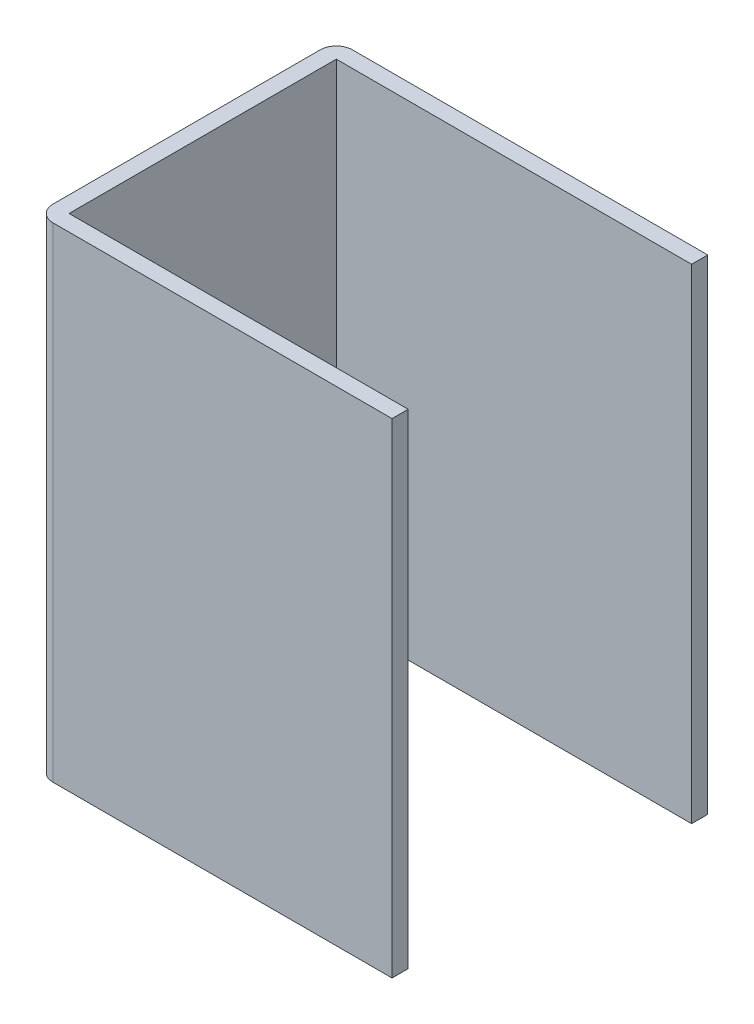
ISO-10303-21;
HEADER;
FILE_DESCRIPTION(('STEP AP214'),'2;1');
FILE_NAME('part.step','',(''),(''),'','','');
FILE_SCHEMA(('AUTOMOTIVE_DESIGN { 1 0 10303 214 1 1 1 1 }'));
ENDSEC;
DATA;
#1=APPLICATION_CONTEXT('core data for automotive mechanical design processes');
#2=APPLICATION_PROTOCOL_DEFINITION('international standard','automotive_design',2000,#1);
#3=PRODUCT_CONTEXT('',#1,'mechanical');
#4=PRODUCT('Part','Part','',(#3));
#5=PRODUCT_RELATED_PRODUCT_CATEGORY('part','',(#4));
#6=PRODUCT_DEFINITION_FORMATION('','',#4);
#7=PRODUCT_DEFINITION_CONTEXT('part definition',#1,'design');
#8=PRODUCT_DEFINITION('design','',#6,#7);
#9=PRODUCT_DEFINITION_SHAPE('','',#8);
#10=(LENGTH_UNIT() NAMED_UNIT(*) SI_UNIT(.MILLI.,.METRE.));
#11=(NAMED_UNIT(*) PLANE_ANGLE_UNIT() SI_UNIT($,.RADIAN.));
#12=(NAMED_UNIT(*) SI_UNIT($,.STERADIAN.) SOLID_ANGLE_UNIT());
#13=UNCERTAINTY_MEASURE_WITH_UNIT(LENGTH_MEASURE(1.E-05),#10,'distance_accuracy_value','');
#14=(GEOMETRIC_REPRESENTATION_CONTEXT(3) GLOBAL_UNCERTAINTY_ASSIGNED_CONTEXT((#13)) GLOBAL_UNIT_ASSIGNED_CONTEXT((#10,
#11,#12)) REPRESENTATION_CONTEXT('',''));
#15=CARTESIAN_POINT('',(0.,0.,0.));
#16=DIRECTION('',(0.,0.,1.));
#17=DIRECTION('',(1.,0.,0.));
#18=AXIS2_PLACEMENT_3D('',#15,#16,#17);
#19=CARTESIAN_POINT('',(-5.4,-1.5,1.755));
#20=DIRECTION('',(0.,1.,0.));
#21=DIRECTION('',(0.,0.,1.));
#22=AXIS2_PLACEMENT_3D('',#19,#20,#21);
#23=CYLINDRICAL_SURFACE('',#22,0.1);
#24=DIRECTION('',(0.,1.,0.));
#25=VECTOR('',#24,1.);
#26=CARTESIAN_POINT('',(-5.5,-1.5,1.755));
#27=LINE('',#26,#25);
#28=CARTESIAN_POINT('',(-5.5,1.5,1.755));
#29=VERTEX_POINT('',#28);
#30=CARTESIAN_POINT('',(-5.5,-1.5,1.755));
#31=VERTEX_POINT('',#30);
#32=EDGE_CURVE('E95',#29,#31,#27,.F.);
#33=ORIENTED_EDGE('',*,*,#32,.T.);
#34=CARTESIAN_POINT('',(-5.4,-1.5,1.755));
#35=DIRECTION('',(0.,1.,0.));
#36=DIRECTION('',(0.,0.,1.));
#37=AXIS2_PLACEMENT_3D('',#34,#35,#36);
#38=CIRCLE('',#37,0.1);
#39=CARTESIAN_POINT('',(-5.4,-1.5,1.855));
#40=VERTEX_POINT('',#39);
#41=EDGE_CURVE('E99',#31,#40,#38,.T.);
#42=ORIENTED_EDGE('',*,*,#41,.T.);
#43=DIRECTION('',(0.,1.,0.));
#44=VECTOR('',#43,1.);
#45=CARTESIAN_POINT('',(-5.4,-1.5,1.855));
#46=LINE('',#45,#44);
#47=CARTESIAN_POINT('',(-5.4,1.5,1.855));
#48=VERTEX_POINT('',#47);
#49=EDGE_CURVE('E97',#48,#40,#46,.F.);
#50=ORIENTED_EDGE('',*,*,#49,.F.);
#51=CARTESIAN_POINT('',(-5.4,1.5,1.755));
#52=DIRECTION('',(0.,1.,0.));
#53=DIRECTION('',(0.,0.,1.));
#54=AXIS2_PLACEMENT_3D('',#51,#52,#53);
#55=CIRCLE('',#54,0.1);
#56=EDGE_CURVE('E20',#48,#29,#55,.F.);
#57=ORIENTED_EDGE('',*,*,#56,.T.);
#58=EDGE_LOOP('',(#33,#42,#50,#57));
#59=FACE_BOUND('',#58,.T.);
#60=ADVANCED_FACE('F17',(#59),#23,.T.);
#61=CARTESIAN_POINT('',(-3.3,-1.5,1.755));
#62=DIRECTION('',(1.,0.,0.));
#63=DIRECTION('',(0.,0.,-1.));
#64=AXIS2_PLACEMENT_3D('',#61,#62,#63);
#65=PLANE('',#64);
#66=DIRECTION('',(0.,0.,-1.));
#67=VECTOR('',#66,1.);
#68=CARTESIAN_POINT('',(-3.3,1.5,1.755));
#69=LINE('',#68,#67);
#70=CARTESIAN_POINT('',(-3.3,1.5,1.755));
#71=VERTEX_POINT('',#70);
#72=CARTESIAN_POINT('',(-3.3,1.5,1.855));
#73=VERTEX_POINT('',#72);
#74=EDGE_CURVE('E162',#71,#73,#69,.F.);
#75=ORIENTED_EDGE('',*,*,#74,.T.);
#76=DIRECTION('',(0.,1.,0.));
#77=VECTOR('',#76,1.);
#78=CARTESIAN_POINT('',(-3.3,-1.5,1.855));
#79=LINE('',#78,#77);
#80=CARTESIAN_POINT('',(-3.3,-1.5,1.855));
#81=VERTEX_POINT('',#80);
#82=EDGE_CURVE('E149',#81,#73,#79,.T.);
#83=ORIENTED_EDGE('',*,*,#82,.F.);
#84=DIRECTION('',(0.,0.,-1.));
#85=VECTOR('',#84,1.);
#86=CARTESIAN_POINT('',(-3.3,-1.5,1.755));
#87=LINE('',#86,#85);
#88=CARTESIAN_POINT('',(-3.3,-1.5,1.755));
#89=VERTEX_POINT('',#88);
#90=EDGE_CURVE('E165',#81,#89,#87,.T.);
#91=ORIENTED_EDGE('',*,*,#90,.T.);
#92=DIRECTION('',(0.,1.,0.));
#93=VECTOR('',#92,1.);
#94=CARTESIAN_POINT('',(-3.3,-1.5,1.755));
#95=LINE('',#94,#93);
#96=EDGE_CURVE('E118',#89,#71,#95,.T.);
#97=ORIENTED_EDGE('',*,*,#96,.T.);
#98=EDGE_LOOP('',(#75,#83,#91,#97));
#99=FACE_BOUND('',#98,.T.);
#100=ADVANCED_FACE('F256',(#99),#65,.T.);
#101=CARTESIAN_POINT('',(-5.4,-1.5,0.));
#102=DIRECTION('',(1.,0.,0.));
#103=DIRECTION('',(0.,0.,-1.));
#104=AXIS2_PLACEMENT_3D('',#101,#102,#103);
#105=PLANE('',#104);
#106=DIRECTION('',(0.,0.,-1.));
#107=VECTOR('',#106,1.);
#108=CARTESIAN_POINT('',(-5.4,1.5,0.));
#109=LINE('',#108,#107);
#110=CARTESIAN_POINT('',(-5.4,1.5,0.1));
#111=VERTEX_POINT('',#110);
#112=CARTESIAN_POINT('',(-5.4,1.5,1.755));
#113=VERTEX_POINT('',#112);
#114=EDGE_CURVE('E155',#111,#113,#109,.F.);
#115=ORIENTED_EDGE('',*,*,#114,.T.);
#116=DIRECTION('',(0.,1.,0.));
#117=VECTOR('',#116,1.);
#118=CARTESIAN_POINT('',(-5.4,-1.5,1.755));
#119=LINE('',#118,#117);
#120=CARTESIAN_POINT('',(-5.4,-1.5,1.755));
#121=VERTEX_POINT('',#120);
#122=EDGE_CURVE('E152',#113,#121,#119,.F.);
#123=ORIENTED_EDGE('',*,*,#122,.T.);
#124=DIRECTION('',(0.,0.,-1.));
#125=VECTOR('',#124,1.);
#126=CARTESIAN_POINT('',(-5.4,-1.5,0.));
#127=LINE('',#126,#125);
#128=CARTESIAN_POINT('',(-5.4,-1.5,0.1));
#129=VERTEX_POINT('',#128);
#130=EDGE_CURVE('E158',#121,#129,#127,.T.);
#131=ORIENTED_EDGE('',*,*,#130,.T.);
#132=DIRECTION('',(0.,1.,0.));
#133=VECTOR('',#132,1.);
#134=CARTESIAN_POINT('',(-5.4,-1.5,0.1));
#135=LINE('',#134,#133);
#136=EDGE_CURVE('E113',#111,#129,#135,.F.);
#137=ORIENTED_EDGE('',*,*,#136,.F.);
#138=EDGE_LOOP('',(#115,#123,#131,#137));
#139=FACE_BOUND('',#138,.T.);
#140=ADVANCED_FACE('F254',(#139),#105,.T.);
#141=CARTESIAN_POINT('',(-5.5,-1.5,0.));
#142=DIRECTION('',(1.,0.,0.));
#143=DIRECTION('',(0.,0.,-1.));
#144=AXIS2_PLACEMENT_3D('',#141,#142,#143);
#145=PLANE('',#144);
#146=DIRECTION('',(0.,0.,1.));
#147=VECTOR('',#146,1.);
#148=CARTESIAN_POINT('',(-5.5,1.5,0.913471223022));
#149=LINE('',#148,#147);
#150=CARTESIAN_POINT('',(-5.5,1.5,0.1));
#151=VERTEX_POINT('',#150);
#152=EDGE_CURVE('E104',#151,#29,#149,.T.);
#153=ORIENTED_EDGE('',*,*,#152,.F.);
#154=DIRECTION('',(0.,1.,0.));
#155=VECTOR('',#154,1.);
#156=CARTESIAN_POINT('',(-5.5,-1.5,0.1));
#157=LINE('',#156,#155);
#158=CARTESIAN_POINT('',(-5.5,-1.5,0.1));
#159=VERTEX_POINT('',#158);
#160=EDGE_CURVE('E131',#159,#151,#157,.T.);
#161=ORIENTED_EDGE('',*,*,#160,.F.);
#162=DIRECTION('',(0.,0.,-1.));
#163=VECTOR('',#162,1.);
#164=CARTESIAN_POINT('',(-5.5,-1.5,0.));
#165=LINE('',#164,#163);
#166=EDGE_CURVE('E106',#31,#159,#165,.T.);
#167=ORIENTED_EDGE('',*,*,#166,.F.);
#168=ORIENTED_EDGE('',*,*,#32,.F.);
#169=EDGE_LOOP('',(#153,#161,#167,#168));
#170=FACE_BOUND('',#169,.T.);
#171=ADVANCED_FACE('F102',(#170),#145,.F.);
#172=CARTESIAN_POINT('',(-5.5,-1.5,1.855));
#173=DIRECTION('',(0.,0.,1.));
#174=DIRECTION('',(1.,0.,0.));
#175=AXIS2_PLACEMENT_3D('',#172,#173,#174);
#176=PLANE('',#175);
#177=DIRECTION('',(1.,0.,0.));
#178=VECTOR('',#177,1.);
#179=CARTESIAN_POINT('',(-4.641846522782,-1.5,1.855));
#180=LINE('',#179,#178);
#181=EDGE_CURVE('E189',#81,#40,#180,.F.);
#182=ORIENTED_EDGE('',*,*,#181,.F.);
#183=ORIENTED_EDGE('',*,*,#82,.T.);
#184=DIRECTION('',(-1.,0.,0.));
#185=VECTOR('',#184,1.);
#186=CARTESIAN_POINT('',(-4.641846522782,1.5,1.855));
#187=LINE('',#186,#185);
#188=EDGE_CURVE('E112',#48,#73,#187,.F.);
#189=ORIENTED_EDGE('',*,*,#188,.F.);
#190=ORIENTED_EDGE('',*,*,#49,.T.);
#191=EDGE_LOOP('',(#182,#183,#189,#190));
#192=FACE_BOUND('',#191,.T.);
#193=ADVANCED_FACE('F194',(#192),#176,.T.);
#194=CARTESIAN_POINT('',(-5.5,-1.5,1.755));
#195=DIRECTION('',(0.,0.,1.));
#196=DIRECTION('',(1.,0.,0.));
#197=AXIS2_PLACEMENT_3D('',#194,#195,#196);
#198=PLANE('',#197);
#199=DIRECTION('',(1.,0.,0.));
#200=VECTOR('',#199,1.);
#201=CARTESIAN_POINT('',(-4.641846522782,-1.5,1.755));
#202=LINE('',#201,#200);
#203=EDGE_CURVE('E141',#121,#89,#202,.T.);
#204=ORIENTED_EDGE('',*,*,#203,.F.);
#205=ORIENTED_EDGE('',*,*,#122,.F.);
#206=DIRECTION('',(-1.,0.,0.));
#207=VECTOR('',#206,1.);
#208=CARTESIAN_POINT('',(-4.641846522782,1.5,1.755));
#209=LINE('',#208,#207);
#210=EDGE_CURVE('E115',#71,#113,#209,.T.);
#211=ORIENTED_EDGE('',*,*,#210,.F.);
#212=ORIENTED_EDGE('',*,*,#96,.F.);
#213=EDGE_LOOP('',(#204,#205,#211,#212));
#214=FACE_BOUND('',#213,.T.);
#215=ADVANCED_FACE('F246',(#214),#198,.F.);
#216=CARTESIAN_POINT('',(-5.5,-1.5,0.1));
#217=DIRECTION('',(0.,0.,1.));
#218=DIRECTION('',(1.,0.,0.));
#219=AXIS2_PLACEMENT_3D('',#216,#217,#218);
#220=PLANE('',#219);
#221=DIRECTION('',(1.,0.,0.));
#222=VECTOR('',#221,1.);
#223=CARTESIAN_POINT('',(-4.641846522782,-1.5,0.1));
#224=LINE('',#223,#222);
#225=CARTESIAN_POINT('',(-3.2,-1.5,0.1));
#226=VERTEX_POINT('',#225);
#227=EDGE_CURVE('E138',#226,#129,#224,.F.);
#228=ORIENTED_EDGE('',*,*,#227,.F.);
#229=DIRECTION('',(0.,1.,0.));
#230=VECTOR('',#229,1.);
#231=CARTESIAN_POINT('',(-3.2,-1.5,0.1));
#232=LINE('',#231,#230);
#233=CARTESIAN_POINT('',(-3.2,1.5,0.1));
#234=VERTEX_POINT('',#233);
#235=EDGE_CURVE('E126',#234,#226,#232,.F.);
#236=ORIENTED_EDGE('',*,*,#235,.F.);
#237=DIRECTION('',(-1.,0.,0.));
#238=VECTOR('',#237,1.);
#239=CARTESIAN_POINT('',(-4.641846522782,1.5,0.1));
#240=LINE('',#239,#238);
#241=EDGE_CURVE('E129',#111,#234,#240,.F.);
#242=ORIENTED_EDGE('',*,*,#241,.F.);
#243=ORIENTED_EDGE('',*,*,#136,.T.);
#244=EDGE_LOOP('',(#228,#236,#242,#243));
#245=FACE_BOUND('',#244,.T.);
#246=ADVANCED_FACE('F226',(#245),#220,.T.);
#247=CARTESIAN_POINT('',(-4.641846522782,1.5,0.913471223022));
#248=DIRECTION('',(0.,1.,0.));
#249=DIRECTION('',(-1.,0.,0.));
#250=AXIS2_PLACEMENT_3D('',#247,#248,#249);
#251=PLANE('',#250);
#252=ORIENTED_EDGE('',*,*,#241,.T.);
#253=DIRECTION('',(0.,0.,-1.));
#254=VECTOR('',#253,1.);
#255=CARTESIAN_POINT('',(-3.2,1.5,0.));
#256=LINE('',#255,#254);
#257=CARTESIAN_POINT('',(-3.2,1.5,0.));
#258=VERTEX_POINT('',#257);
#259=EDGE_CURVE('E123',#258,#234,#256,.F.);
#260=ORIENTED_EDGE('',*,*,#259,.F.);
#261=DIRECTION('',(1.,0.,0.));
#262=VECTOR('',#261,1.);
#263=CARTESIAN_POINT('',(-5.5,1.5,0.));
#264=LINE('',#263,#262);
#265=CARTESIAN_POINT('',(-5.4,1.5,0.));
#266=VERTEX_POINT('',#265);
#267=EDGE_CURVE('E135',#258,#266,#264,.F.);
#268=ORIENTED_EDGE('',*,*,#267,.T.);
#269=CARTESIAN_POINT('',(-5.4,1.5,0.1));
#270=DIRECTION('',(0.,1.,0.));
#271=DIRECTION('',(0.,0.,1.));
#272=AXIS2_PLACEMENT_3D('',#269,#270,#271);
#273=CIRCLE('',#272,0.1);
#274=EDGE_CURVE('E111',#151,#266,#273,.F.);
#275=ORIENTED_EDGE('',*,*,#274,.F.);
#276=ORIENTED_EDGE('',*,*,#152,.T.);
#277=ORIENTED_EDGE('',*,*,#56,.F.);
#278=ORIENTED_EDGE('',*,*,#188,.T.);
#279=ORIENTED_EDGE('',*,*,#74,.F.);
#280=ORIENTED_EDGE('',*,*,#210,.T.);
#281=ORIENTED_EDGE('',*,*,#114,.F.);
#282=EDGE_LOOP('',(#252,#260,#268,#275,#276,#277,#278,#279,#280,#281));
#283=FACE_BOUND('',#282,.T.);
#284=ADVANCED_FACE('F109',(#283),#251,.T.);
#285=CARTESIAN_POINT('',(-5.4,-1.5,0.1));
#286=DIRECTION('',(0.,1.,0.));
#287=DIRECTION('',(0.,0.,1.));
#288=AXIS2_PLACEMENT_3D('',#285,#286,#287);
#289=CYLINDRICAL_SURFACE('',#288,0.1);
#290=DIRECTION('',(0.,1.,0.));
#291=VECTOR('',#290,1.);
#292=CARTESIAN_POINT('',(-5.4,-1.5,0.));
#293=LINE('',#292,#291);
#294=CARTESIAN_POINT('',(-5.4,-1.5,0.));
#295=VERTEX_POINT('',#294);
#296=EDGE_CURVE('E201',#266,#295,#293,.F.);
#297=ORIENTED_EDGE('',*,*,#296,.T.);
#298=CARTESIAN_POINT('',(-5.4,-1.5,0.1));
#299=DIRECTION('',(0.,1.,0.));
#300=DIRECTION('',(0.,0.,1.));
#301=AXIS2_PLACEMENT_3D('',#298,#299,#300);
#302=CIRCLE('',#301,0.1);
#303=EDGE_CURVE('E142',#159,#295,#302,.F.);
#304=ORIENTED_EDGE('',*,*,#303,.F.);
#305=ORIENTED_EDGE('',*,*,#160,.T.);
#306=ORIENTED_EDGE('',*,*,#274,.T.);
#307=EDGE_LOOP('',(#297,#304,#305,#306));
#308=FACE_BOUND('',#307,.T.);
#309=ADVANCED_FACE('F223',(#308),#289,.T.);
#310=CARTESIAN_POINT('',(-4.641846522782,-1.5,0.913471223022));
#311=DIRECTION('',(0.,-1.,0.));
#312=DIRECTION('',(0.,0.,-1.));
#313=AXIS2_PLACEMENT_3D('',#310,#311,#312);
#314=PLANE('',#313);
#315=ORIENTED_EDGE('',*,*,#203,.T.);
#316=ORIENTED_EDGE('',*,*,#90,.F.);
#317=ORIENTED_EDGE('',*,*,#181,.T.);
#318=ORIENTED_EDGE('',*,*,#41,.F.);
#319=ORIENTED_EDGE('',*,*,#166,.T.);
#320=ORIENTED_EDGE('',*,*,#303,.T.);
#321=DIRECTION('',(1.,0.,0.));
#322=VECTOR('',#321,1.);
#323=CARTESIAN_POINT('',(-5.5,-1.5,0.));
#324=LINE('',#323,#322);
#325=CARTESIAN_POINT('',(-3.2,-1.5,0.));
#326=VERTEX_POINT('',#325);
#327=EDGE_CURVE('E26',#295,#326,#324,.T.);
#328=ORIENTED_EDGE('',*,*,#327,.T.);
#329=DIRECTION('',(0.,0.,-1.));
#330=VECTOR('',#329,1.);
#331=CARTESIAN_POINT('',(-3.2,-1.5,0.));
#332=LINE('',#331,#330);
#333=EDGE_CURVE('E34',#226,#326,#332,.T.);
#334=ORIENTED_EDGE('',*,*,#333,.F.);
#335=ORIENTED_EDGE('',*,*,#227,.T.);
#336=ORIENTED_EDGE('',*,*,#130,.F.);
#337=EDGE_LOOP('',(#315,#316,#317,#318,#319,#320,#328,#334,#335,#336));
#338=FACE_BOUND('',#337,.T.);
#339=ADVANCED_FACE('F195',(#338),#314,.T.);
#340=CARTESIAN_POINT('',(-3.2,-1.5,0.));
#341=DIRECTION('',(1.,0.,0.));
#342=DIRECTION('',(0.,0.,-1.));
#343=AXIS2_PLACEMENT_3D('',#340,#341,#342);
#344=PLANE('',#343);
#345=ORIENTED_EDGE('',*,*,#259,.T.);
#346=ORIENTED_EDGE('',*,*,#235,.T.);
#347=ORIENTED_EDGE('',*,*,#333,.T.);
#348=DIRECTION('',(0.,1.,0.));
#349=VECTOR('',#348,1.);
#350=CARTESIAN_POINT('',(-3.2,-1.5,0.));
#351=LINE('',#350,#349);
#352=EDGE_CURVE('E11',#326,#258,#351,.T.);
#353=ORIENTED_EDGE('',*,*,#352,.T.);
#354=EDGE_LOOP('',(#345,#346,#347,#353));
#355=FACE_BOUND('',#354,.T.);
#356=ADVANCED_FACE('F229',(#355),#344,.T.);
#357=CARTESIAN_POINT('',(-5.5,-1.5,0.));
#358=DIRECTION('',(0.,0.,1.));
#359=DIRECTION('',(1.,0.,0.));
#360=AXIS2_PLACEMENT_3D('',#357,#358,#359);
#361=PLANE('',#360);
#362=ORIENTED_EDGE('',*,*,#327,.F.);
#363=ORIENTED_EDGE('',*,*,#296,.F.);
#364=ORIENTED_EDGE('',*,*,#267,.F.);
#365=ORIENTED_EDGE('',*,*,#352,.F.);
#366=EDGE_LOOP('',(#362,#363,#364,#365));
#367=FACE_BOUND('',#366,.T.);
#368=ADVANCED_FACE('F220',(#367),#361,.F.);
#369=CLOSED_SHELL('',(#60,#100,#140,#171,#193,#215,#246,#284,#309,#339,#356,#368));
#370=MANIFOLD_SOLID_BREP('B1',#369);
#371=ADVANCED_BREP_SHAPE_REPRESENTATION('',(#18,#370),#14);
#372=SHAPE_DEFINITION_REPRESENTATION(#9,#371);
ENDSEC;
END-ISO-10303-21;
